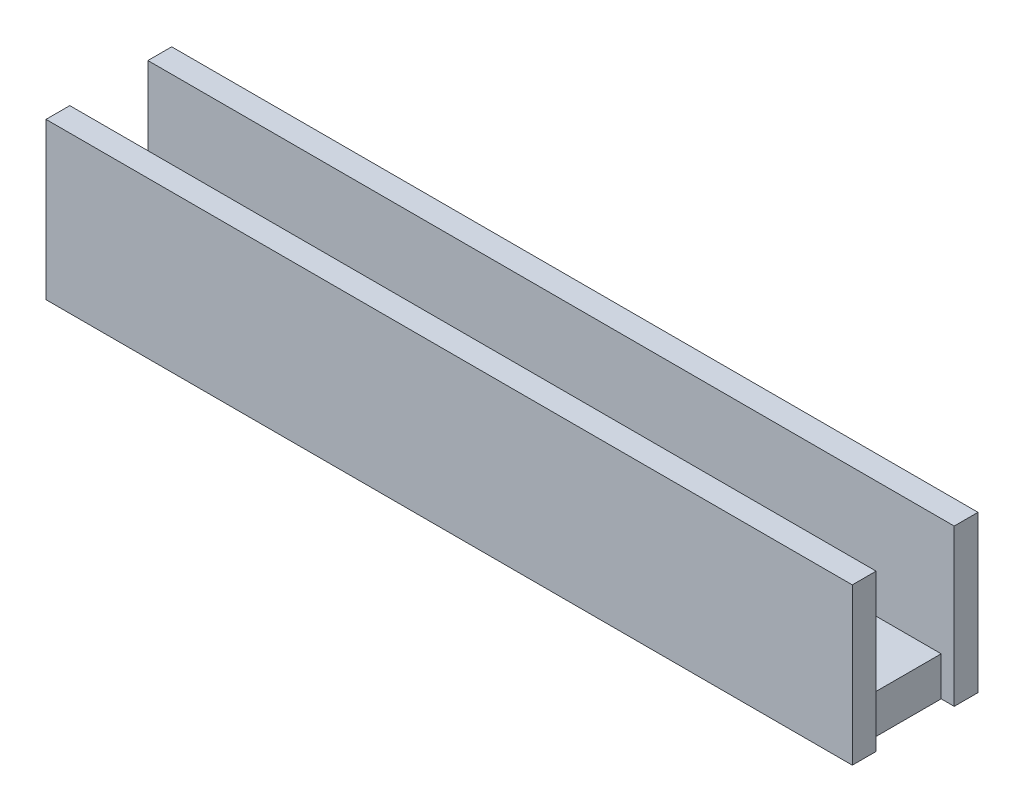
ISO-10303-21;
HEADER;
FILE_DESCRIPTION(('STEP AP214'),'2;1');
FILE_NAME('part.step','',(''),(''),'','','');
FILE_SCHEMA(('AUTOMOTIVE_DESIGN { 1 0 10303 214 1 1 1 1 }'));
ENDSEC;
DATA;
#1=APPLICATION_CONTEXT('core data for automotive mechanical design processes');
#2=APPLICATION_PROTOCOL_DEFINITION('international standard','automotive_design',2000,#1);
#3=PRODUCT_CONTEXT('',#1,'mechanical');
#4=PRODUCT('Part','Part','',(#3));
#5=PRODUCT_RELATED_PRODUCT_CATEGORY('part','',(#4));
#6=PRODUCT_DEFINITION_FORMATION('','',#4);
#7=PRODUCT_DEFINITION_CONTEXT('part definition',#1,'design');
#8=PRODUCT_DEFINITION('design','',#6,#7);
#9=PRODUCT_DEFINITION_SHAPE('','',#8);
#10=(LENGTH_UNIT() NAMED_UNIT(*) SI_UNIT(.MILLI.,.METRE.));
#11=(NAMED_UNIT(*) PLANE_ANGLE_UNIT() SI_UNIT($,.RADIAN.));
#12=(NAMED_UNIT(*) SI_UNIT($,.STERADIAN.) SOLID_ANGLE_UNIT());
#13=UNCERTAINTY_MEASURE_WITH_UNIT(LENGTH_MEASURE(1.E-05),#10,'distance_accuracy_value','');
#14=(GEOMETRIC_REPRESENTATION_CONTEXT(3) GLOBAL_UNCERTAINTY_ASSIGNED_CONTEXT((#13)) GLOBAL_UNIT_ASSIGNED_CONTEXT((#10,
#11,#12)) REPRESENTATION_CONTEXT('',''));
#15=CARTESIAN_POINT('',(0.,0.,0.));
#16=DIRECTION('',(0.,0.,1.));
#17=DIRECTION('',(1.,0.,0.));
#18=AXIS2_PLACEMENT_3D('',#15,#16,#17);
#19=CARTESIAN_POINT('',(50.83283900378,10.,4.999999906));
#20=DIRECTION('',(1.,0.,0.));
#21=DIRECTION('',(0.,0.,-1.));
#22=AXIS2_PLACEMENT_3D('',#19,#20,#21);
#23=PLANE('',#22);
#24=DIRECTION('',(0.,0.,1.));
#25=VECTOR('',#24,1.);
#26=CARTESIAN_POINT('',(50.83283900378,0.,4.999999906));
#27=LINE('',#26,#25);
#28=CARTESIAN_POINT('',(50.83283900378,0.,4.999999906));
#29=VERTEX_POINT('',#28);
#30=CARTESIAN_POINT('',(50.83283900378,0.,6.52399990599999));
#31=VERTEX_POINT('',#30);
#32=EDGE_CURVE('E12',#29,#31,#27,.T.);
#33=ORIENTED_EDGE('',*,*,#32,.F.);
#34=DIRECTION('',(0.,-1.,0.));
#35=VECTOR('',#34,1.);
#36=CARTESIAN_POINT('',(50.83283900378,10.,4.999999906));
#37=LINE('',#36,#35);
#38=CARTESIAN_POINT('',(50.83283900378,10.,4.999999906));
#39=VERTEX_POINT('',#38);
#40=EDGE_CURVE('E105',#39,#29,#37,.T.);
#41=ORIENTED_EDGE('',*,*,#40,.F.);
#42=DIRECTION('',(0.,0.,1.));
#43=VECTOR('',#42,1.);
#44=CARTESIAN_POINT('',(50.83283900378,10.,4.999999906));
#45=LINE('',#44,#43);
#46=CARTESIAN_POINT('',(50.83283900378,10.,6.52399990599999));
#47=VERTEX_POINT('',#46);
#48=EDGE_CURVE('E62',#39,#47,#45,.T.);
#49=ORIENTED_EDGE('',*,*,#48,.T.);
#50=DIRECTION('',(0.,-1.,0.));
#51=VECTOR('',#50,1.);
#52=CARTESIAN_POINT('',(50.83283900378,10.,6.52399990599999));
#53=LINE('',#52,#51);
#54=EDGE_CURVE('E77',#47,#31,#53,.T.);
#55=ORIENTED_EDGE('',*,*,#54,.T.);
#56=EDGE_LOOP('',(#33,#41,#49,#55));
#57=FACE_BOUND('',#56,.T.);
#58=ADVANCED_FACE('F58',(#57),#23,.T.);
#59=CARTESIAN_POINT('',(-0.792660996219982,10.,4.999999906));
#60=DIRECTION('',(0.,0.,-1.));
#61=DIRECTION('',(-1.,0.,0.));
#62=AXIS2_PLACEMENT_3D('',#59,#60,#61);
#63=PLANE('',#62);
#64=DIRECTION('',(1.,0.,0.));
#65=VECTOR('',#64,1.);
#66=CARTESIAN_POINT('',(-0.792660996219982,0.,4.999999906));
#67=LINE('',#66,#65);
#68=CARTESIAN_POINT('',(-0.792660996219982,0.,4.999999906));
#69=VERTEX_POINT('',#68);
#70=EDGE_CURVE('E118',#69,#29,#67,.T.);
#71=ORIENTED_EDGE('',*,*,#70,.F.);
#72=DIRECTION('',(0.,-1.,0.));
#73=VECTOR('',#72,1.);
#74=CARTESIAN_POINT('',(-0.792660996219982,10.,4.999999906));
#75=LINE('',#74,#73);
#76=CARTESIAN_POINT('',(-0.792660996219982,10.,4.999999906));
#77=VERTEX_POINT('',#76);
#78=EDGE_CURVE('E107',#77,#69,#75,.T.);
#79=ORIENTED_EDGE('',*,*,#78,.F.);
#80=DIRECTION('',(1.,0.,0.));
#81=VECTOR('',#80,1.);
#82=CARTESIAN_POINT('',(-0.792660996219982,10.,4.999999906));
#83=LINE('',#82,#81);
#84=EDGE_CURVE('E126',#77,#39,#83,.T.);
#85=ORIENTED_EDGE('',*,*,#84,.T.);
#86=ORIENTED_EDGE('',*,*,#40,.T.);
#87=EDGE_LOOP('',(#71,#79,#85,#86));
#88=FACE_BOUND('',#87,.T.);
#89=ADVANCED_FACE('F120',(#88),#63,.T.);
#90=CARTESIAN_POINT('',(-0.792660996219982,10.,6.523999906));
#91=DIRECTION('',(-1.,0.,0.));
#92=DIRECTION('',(0.,0.,1.));
#93=AXIS2_PLACEMENT_3D('',#90,#91,#92);
#94=PLANE('',#93);
#95=DIRECTION('',(0.,0.,-1.));
#96=VECTOR('',#95,1.);
#97=CARTESIAN_POINT('',(-0.792660996219982,0.,6.523999906));
#98=LINE('',#97,#96);
#99=CARTESIAN_POINT('',(-0.792660996219982,0.,6.523999906));
#100=VERTEX_POINT('',#99);
#101=EDGE_CURVE('E110',#100,#69,#98,.T.);
#102=ORIENTED_EDGE('',*,*,#101,.F.);
#103=DIRECTION('',(0.,-1.,0.));
#104=VECTOR('',#103,1.);
#105=CARTESIAN_POINT('',(-0.792660996219982,10.,6.523999906));
#106=LINE('',#105,#104);
#107=CARTESIAN_POINT('',(-0.792660996219982,10.,6.523999906));
#108=VERTEX_POINT('',#107);
#109=EDGE_CURVE('E94',#108,#100,#106,.T.);
#110=ORIENTED_EDGE('',*,*,#109,.F.);
#111=DIRECTION('',(0.,0.,-1.));
#112=VECTOR('',#111,1.);
#113=CARTESIAN_POINT('',(-0.792660996219982,10.,6.523999906));
#114=LINE('',#113,#112);
#115=EDGE_CURVE('E112',#108,#77,#114,.T.);
#116=ORIENTED_EDGE('',*,*,#115,.T.);
#117=ORIENTED_EDGE('',*,*,#78,.T.);
#118=EDGE_LOOP('',(#102,#110,#116,#117));
#119=FACE_BOUND('',#118,.T.);
#120=ADVANCED_FACE('F109',(#119),#94,.T.);
#121=CARTESIAN_POINT('',(50.83283900378,10.,6.52399990599999));
#122=DIRECTION('',(0.,0.,1.));
#123=DIRECTION('',(1.,0.,0.));
#124=AXIS2_PLACEMENT_3D('',#121,#122,#123);
#125=PLANE('',#124);
#126=DIRECTION('',(-1.,0.,0.));
#127=VECTOR('',#126,1.);
#128=CARTESIAN_POINT('',(50.83283900378,0.,6.52399990599999));
#129=LINE('',#128,#127);
#130=EDGE_CURVE('E68',#31,#100,#129,.T.);
#131=ORIENTED_EDGE('',*,*,#130,.F.);
#132=ORIENTED_EDGE('',*,*,#54,.F.);
#133=DIRECTION('',(-1.,0.,0.));
#134=VECTOR('',#133,1.);
#135=CARTESIAN_POINT('',(50.83283900378,10.,6.52399990599999));
#136=LINE('',#135,#134);
#137=EDGE_CURVE('E122',#47,#108,#136,.T.);
#138=ORIENTED_EDGE('',*,*,#137,.T.);
#139=ORIENTED_EDGE('',*,*,#109,.T.);
#140=EDGE_LOOP('',(#131,#132,#138,#139));
#141=FACE_BOUND('',#140,.T.);
#142=ADVANCED_FACE('F128',(#141),#125,.T.);
#143=CARTESIAN_POINT('',(0.,10.,0.));
#144=DIRECTION('',(0.,-1.,0.));
#145=DIRECTION('',(0.,0.,-1.));
#146=AXIS2_PLACEMENT_3D('',#143,#144,#145);
#147=PLANE('',#146);
#148=ORIENTED_EDGE('',*,*,#48,.F.);
#149=ORIENTED_EDGE('',*,*,#84,.F.);
#150=ORIENTED_EDGE('',*,*,#115,.F.);
#151=ORIENTED_EDGE('',*,*,#137,.F.);
#152=EDGE_LOOP('',(#148,#149,#150,#151));
#153=FACE_BOUND('',#152,.T.);
#154=ADVANCED_FACE('F60',(#153),#147,.F.);
#155=CARTESIAN_POINT('',(0.,0.,0.));
#156=DIRECTION('',(0.,-1.,0.));
#157=DIRECTION('',(0.,0.,-1.));
#158=AXIS2_PLACEMENT_3D('',#155,#156,#157);
#159=PLANE('',#158);
#160=ORIENTED_EDGE('',*,*,#32,.T.);
#161=ORIENTED_EDGE('',*,*,#130,.T.);
#162=ORIENTED_EDGE('',*,*,#101,.T.);
#163=ORIENTED_EDGE('',*,*,#70,.T.);
#164=EDGE_LOOP('',(#160,#161,#162,#163));
#165=FACE_BOUND('',#164,.T.);
#166=ADVANCED_FACE('F117',(#165),#159,.T.);
#167=CLOSED_SHELL('',(#58,#89,#120,#142,#154,#166));
#168=MANIFOLD_SOLID_BREP('B2',#167);
#169=CARTESIAN_POINT('',(50.83283900378,10.,0.));
#170=DIRECTION('',(1.,0.,0.));
#171=DIRECTION('',(0.,0.,-1.));
#172=AXIS2_PLACEMENT_3D('',#169,#170,#171);
#173=PLANE('',#172);
#174=DIRECTION('',(0.,0.,1.));
#175=VECTOR('',#174,1.);
#176=CARTESIAN_POINT('',(50.83283900378,0.,0.));
#177=LINE('',#176,#175);
#178=CARTESIAN_POINT('',(50.83283900378,0.,-1.524));
#179=VERTEX_POINT('',#178);
#180=CARTESIAN_POINT('',(50.83283900378,0.,0.));
#181=VERTEX_POINT('',#180);
#182=EDGE_CURVE('E272',#179,#181,#177,.T.);
#183=ORIENTED_EDGE('',*,*,#182,.F.);
#184=DIRECTION('',(0.,-1.,0.));
#185=VECTOR('',#184,1.);
#186=CARTESIAN_POINT('',(50.83283900378,10.,-1.524));
#187=LINE('',#186,#185);
#188=CARTESIAN_POINT('',(50.83283900378,10.,-1.524));
#189=VERTEX_POINT('',#188);
#190=EDGE_CURVE('E56',#189,#179,#187,.T.);
#191=ORIENTED_EDGE('',*,*,#190,.F.);
#192=DIRECTION('',(0.,0.,1.));
#193=VECTOR('',#192,1.);
#194=CARTESIAN_POINT('',(50.83283900378,10.,0.));
#195=LINE('',#194,#193);
#196=CARTESIAN_POINT('',(50.83283900378,10.,0.));
#197=VERTEX_POINT('',#196);
#198=EDGE_CURVE('E263',#189,#197,#195,.T.);
#199=ORIENTED_EDGE('',*,*,#198,.T.);
#200=DIRECTION('',(0.,-1.,0.));
#201=VECTOR('',#200,1.);
#202=CARTESIAN_POINT('',(50.83283900378,10.,0.));
#203=LINE('',#202,#201);
#204=EDGE_CURVE('E242',#197,#181,#203,.T.);
#205=ORIENTED_EDGE('',*,*,#204,.T.);
#206=EDGE_LOOP('',(#183,#191,#199,#205));
#207=FACE_BOUND('',#206,.T.);
#208=ADVANCED_FACE('F203',(#207),#173,.T.);
#209=CARTESIAN_POINT('',(0.,10.,-1.524));
#210=DIRECTION('',(0.,0.,-1.));
#211=DIRECTION('',(-1.,0.,0.));
#212=AXIS2_PLACEMENT_3D('',#209,#210,#211);
#213=PLANE('',#212);
#214=DIRECTION('',(1.,0.,0.));
#215=VECTOR('',#214,1.);
#216=CARTESIAN_POINT('',(0.,0.,-1.524));
#217=LINE('',#216,#215);
#218=CARTESIAN_POINT('',(-0.792660996219982,0.,-1.524));
#219=VERTEX_POINT('',#218);
#220=EDGE_CURVE('E255',#219,#179,#217,.T.);
#221=ORIENTED_EDGE('',*,*,#220,.F.);
#222=DIRECTION('',(0.,-1.,0.));
#223=VECTOR('',#222,1.);
#224=CARTESIAN_POINT('',(-0.792660996219982,10.,-1.524));
#225=LINE('',#224,#223);
#226=CARTESIAN_POINT('',(-0.792660996219982,10.,-1.524));
#227=VERTEX_POINT('',#226);
#228=EDGE_CURVE('E212',#227,#219,#225,.T.);
#229=ORIENTED_EDGE('',*,*,#228,.F.);
#230=DIRECTION('',(1.,0.,0.));
#231=VECTOR('',#230,1.);
#232=CARTESIAN_POINT('',(0.,10.,-1.524));
#233=LINE('',#232,#231);
#234=EDGE_CURVE('E253',#227,#189,#233,.T.);
#235=ORIENTED_EDGE('',*,*,#234,.T.);
#236=ORIENTED_EDGE('',*,*,#190,.T.);
#237=EDGE_LOOP('',(#221,#229,#235,#236));
#238=FACE_BOUND('',#237,.T.);
#239=ADVANCED_FACE('F251',(#238),#213,.T.);
#240=CARTESIAN_POINT('',(-0.792660996219982,10.,0.));
#241=DIRECTION('',(1.,0.,0.));
#242=DIRECTION('',(0.,0.,-1.));
#243=AXIS2_PLACEMENT_3D('',#240,#241,#242);
#244=PLANE('',#243);
#245=DIRECTION('',(0.,0.,1.));
#246=VECTOR('',#245,1.);
#247=CARTESIAN_POINT('',(-0.792660996219982,0.,0.));
#248=LINE('',#247,#246);
#249=CARTESIAN_POINT('',(-0.792660996219982,0.,0.));
#250=VERTEX_POINT('',#249);
#251=EDGE_CURVE('E235',#219,#250,#248,.T.);
#252=ORIENTED_EDGE('',*,*,#251,.T.);
#253=DIRECTION('',(0.,-1.,0.));
#254=VECTOR('',#253,1.);
#255=CARTESIAN_POINT('',(-0.792660996219982,10.,0.));
#256=LINE('',#255,#254);
#257=CARTESIAN_POINT('',(-0.792660996219982,10.,0.));
#258=VERTEX_POINT('',#257);
#259=EDGE_CURVE('E257',#258,#250,#256,.T.);
#260=ORIENTED_EDGE('',*,*,#259,.F.);
#261=DIRECTION('',(0.,0.,1.));
#262=VECTOR('',#261,1.);
#263=CARTESIAN_POINT('',(-0.792660996219982,10.,0.));
#264=LINE('',#263,#262);
#265=EDGE_CURVE('E258',#227,#258,#264,.T.);
#266=ORIENTED_EDGE('',*,*,#265,.F.);
#267=ORIENTED_EDGE('',*,*,#228,.T.);
#268=EDGE_LOOP('',(#252,#260,#266,#267));
#269=FACE_BOUND('',#268,.T.);
#270=ADVANCED_FACE('F259',(#269),#244,.F.);
#271=CARTESIAN_POINT('',(0.,10.,0.));
#272=DIRECTION('',(0.,0.,-1.));
#273=DIRECTION('',(-1.,0.,0.));
#274=AXIS2_PLACEMENT_3D('',#271,#272,#273);
#275=PLANE('',#274);
#276=DIRECTION('',(1.,0.,0.));
#277=VECTOR('',#276,1.);
#278=CARTESIAN_POINT('',(0.,0.,0.));
#279=LINE('',#278,#277);
#280=EDGE_CURVE('E267',#250,#181,#279,.T.);
#281=ORIENTED_EDGE('',*,*,#280,.T.);
#282=ORIENTED_EDGE('',*,*,#204,.F.);
#283=DIRECTION('',(1.,0.,0.));
#284=VECTOR('',#283,1.);
#285=CARTESIAN_POINT('',(0.,10.,0.));
#286=LINE('',#285,#284);
#287=EDGE_CURVE('E220',#258,#197,#286,.T.);
#288=ORIENTED_EDGE('',*,*,#287,.F.);
#289=ORIENTED_EDGE('',*,*,#259,.T.);
#290=EDGE_LOOP('',(#281,#282,#288,#289));
#291=FACE_BOUND('',#290,.T.);
#292=ADVANCED_FACE('F287',(#291),#275,.F.);
#293=CARTESIAN_POINT('',(0.,10.,0.));
#294=DIRECTION('',(0.,1.,0.));
#295=DIRECTION('',(0.,0.,1.));
#296=AXIS2_PLACEMENT_3D('',#293,#294,#295);
#297=PLANE('',#296);
#298=ORIENTED_EDGE('',*,*,#198,.F.);
#299=ORIENTED_EDGE('',*,*,#234,.F.);
#300=ORIENTED_EDGE('',*,*,#265,.T.);
#301=ORIENTED_EDGE('',*,*,#287,.T.);
#302=EDGE_LOOP('',(#298,#299,#300,#301));
#303=FACE_BOUND('',#302,.T.);
#304=ADVANCED_FACE('F262',(#303),#297,.T.);
#305=CARTESIAN_POINT('',(0.,0.,0.));
#306=DIRECTION('',(0.,1.,0.));
#307=DIRECTION('',(0.,0.,1.));
#308=AXIS2_PLACEMENT_3D('',#305,#306,#307);
#309=PLANE('',#308);
#310=ORIENTED_EDGE('',*,*,#182,.T.);
#311=ORIENTED_EDGE('',*,*,#280,.F.);
#312=ORIENTED_EDGE('',*,*,#251,.F.);
#313=ORIENTED_EDGE('',*,*,#220,.T.);
#314=EDGE_LOOP('',(#310,#311,#312,#313));
#315=FACE_BOUND('',#314,.T.);
#316=ADVANCED_FACE('F289',(#315),#309,.F.);
#317=CLOSED_SHELL('',(#208,#239,#270,#292,#304,#316));
#318=MANIFOLD_SOLID_BREP('B6',#317);
#319=CARTESIAN_POINT('',(50.,2.5,0.));
#320=DIRECTION('',(1.,0.,0.));
#321=DIRECTION('',(0.,0.,-1.));
#322=AXIS2_PLACEMENT_3D('',#319,#320,#321);
#323=PLANE('',#322);
#324=DIRECTION('',(0.,0.,1.));
#325=VECTOR('',#324,1.);
#326=CARTESIAN_POINT('',(50.,0.,0.));
#327=LINE('',#326,#325);
#328=CARTESIAN_POINT('',(50.,0.,0.));
#329=VERTEX_POINT('',#328);
#330=CARTESIAN_POINT('',(50.,0.,4.999999906));
#331=VERTEX_POINT('',#330);
#332=EDGE_CURVE('E417',#329,#331,#327,.T.);
#333=ORIENTED_EDGE('',*,*,#332,.F.);
#334=DIRECTION('',(0.,-1.,0.));
#335=VECTOR('',#334,1.);
#336=CARTESIAN_POINT('',(50.,2.5,0.));
#337=LINE('',#336,#335);
#338=CARTESIAN_POINT('',(50.,2.5,0.));
#339=VERTEX_POINT('',#338);
#340=EDGE_CURVE('E201',#339,#329,#337,.T.);
#341=ORIENTED_EDGE('',*,*,#340,.F.);
#342=DIRECTION('',(0.,0.,1.));
#343=VECTOR('',#342,1.);
#344=CARTESIAN_POINT('',(50.,2.5,0.));
#345=LINE('',#344,#343);
#346=CARTESIAN_POINT('',(50.,2.5,4.999999906));
#347=VERTEX_POINT('',#346);
#348=EDGE_CURVE('E411',#339,#347,#345,.T.);
#349=ORIENTED_EDGE('',*,*,#348,.T.);
#350=DIRECTION('',(0.,-1.,0.));
#351=VECTOR('',#350,1.);
#352=CARTESIAN_POINT('',(50.,2.5,4.999999906));
#353=LINE('',#352,#351);
#354=EDGE_CURVE('E392',#347,#331,#353,.T.);
#355=ORIENTED_EDGE('',*,*,#354,.T.);
#356=EDGE_LOOP('',(#333,#341,#349,#355));
#357=FACE_BOUND('',#356,.T.);
#358=ADVANCED_FACE('F354',(#357),#323,.T.);
#359=CARTESIAN_POINT('',(0.,2.5,0.));
#360=DIRECTION('',(0.,0.,-1.));
#361=DIRECTION('',(-1.,0.,0.));
#362=AXIS2_PLACEMENT_3D('',#359,#360,#361);
#363=PLANE('',#362);
#364=DIRECTION('',(1.,0.,0.));
#365=VECTOR('',#364,1.);
#366=CARTESIAN_POINT('',(0.,0.,0.));
#367=LINE('',#366,#365);
#368=CARTESIAN_POINT('',(0.,0.,0.));
#369=VERTEX_POINT('',#368);
#370=EDGE_CURVE('E405',#369,#329,#367,.T.);
#371=ORIENTED_EDGE('',*,*,#370,.F.);
#372=DIRECTION('',(0.,-1.,0.));
#373=VECTOR('',#372,1.);
#374=CARTESIAN_POINT('',(0.,2.5,0.));
#375=LINE('',#374,#373);
#376=CARTESIAN_POINT('',(0.,2.5,0.));
#377=VERTEX_POINT('',#376);
#378=EDGE_CURVE('E362',#377,#369,#375,.T.);
#379=ORIENTED_EDGE('',*,*,#378,.F.);
#380=DIRECTION('',(1.,0.,0.));
#381=VECTOR('',#380,1.);
#382=CARTESIAN_POINT('',(0.,2.5,0.));
#383=LINE('',#382,#381);
#384=EDGE_CURVE('E403',#377,#339,#383,.T.);
#385=ORIENTED_EDGE('',*,*,#384,.T.);
#386=ORIENTED_EDGE('',*,*,#340,.T.);
#387=EDGE_LOOP('',(#371,#379,#385,#386));
#388=FACE_BOUND('',#387,.T.);
#389=ADVANCED_FACE('F401',(#388),#363,.T.);
#390=CARTESIAN_POINT('',(0.,2.5,0.));
#391=DIRECTION('',(1.,0.,0.));
#392=DIRECTION('',(0.,0.,-1.));
#393=AXIS2_PLACEMENT_3D('',#390,#391,#392);
#394=PLANE('',#393);
#395=DIRECTION('',(0.,0.,1.));
#396=VECTOR('',#395,1.);
#397=CARTESIAN_POINT('',(0.,0.,0.));
#398=LINE('',#397,#396);
#399=CARTESIAN_POINT('',(0.,0.,4.999999906));
#400=VERTEX_POINT('',#399);
#401=EDGE_CURVE('E385',#369,#400,#398,.T.);
#402=ORIENTED_EDGE('',*,*,#401,.T.);
#403=DIRECTION('',(0.,-1.,0.));
#404=VECTOR('',#403,1.);
#405=CARTESIAN_POINT('',(0.,2.5,4.999999906));
#406=LINE('',#405,#404);
#407=CARTESIAN_POINT('',(0.,2.5,4.999999906));
#408=VERTEX_POINT('',#407);
#409=EDGE_CURVE('E406',#408,#400,#406,.T.);
#410=ORIENTED_EDGE('',*,*,#409,.F.);
#411=DIRECTION('',(0.,0.,1.));
#412=VECTOR('',#411,1.);
#413=CARTESIAN_POINT('',(0.,2.5,0.));
#414=LINE('',#413,#412);
#415=EDGE_CURVE('E407',#377,#408,#414,.T.);
#416=ORIENTED_EDGE('',*,*,#415,.F.);
#417=ORIENTED_EDGE('',*,*,#378,.T.);
#418=EDGE_LOOP('',(#402,#410,#416,#417));
#419=FACE_BOUND('',#418,.T.);
#420=ADVANCED_FACE('F408',(#419),#394,.F.);
#421=CARTESIAN_POINT('',(0.,2.5,4.999999906));
#422=DIRECTION('',(0.,0.,-1.));
#423=DIRECTION('',(-1.,0.,0.));
#424=AXIS2_PLACEMENT_3D('',#421,#422,#423);
#425=PLANE('',#424);
#426=DIRECTION('',(1.,0.,0.));
#427=VECTOR('',#426,1.);
#428=CARTESIAN_POINT('',(0.,0.,4.999999906));
#429=LINE('',#428,#427);
#430=EDGE_CURVE('E413',#400,#331,#429,.T.);
#431=ORIENTED_EDGE('',*,*,#430,.T.);
#432=ORIENTED_EDGE('',*,*,#354,.F.);
#433=DIRECTION('',(1.,0.,0.));
#434=VECTOR('',#433,1.);
#435=CARTESIAN_POINT('',(0.,2.5,4.999999906));
#436=LINE('',#435,#434);
#437=EDGE_CURVE('E370',#408,#347,#436,.T.);
#438=ORIENTED_EDGE('',*,*,#437,.F.);
#439=ORIENTED_EDGE('',*,*,#409,.T.);
#440=EDGE_LOOP('',(#431,#432,#438,#439));
#441=FACE_BOUND('',#440,.T.);
#442=ADVANCED_FACE('F426',(#441),#425,.F.);
#443=CARTESIAN_POINT('',(0.,2.5,0.));
#444=DIRECTION('',(0.,1.,0.));
#445=DIRECTION('',(0.,0.,1.));
#446=AXIS2_PLACEMENT_3D('',#443,#444,#445);
#447=PLANE('',#446);
#448=ORIENTED_EDGE('',*,*,#348,.F.);
#449=ORIENTED_EDGE('',*,*,#384,.F.);
#450=ORIENTED_EDGE('',*,*,#415,.T.);
#451=ORIENTED_EDGE('',*,*,#437,.T.);
#452=EDGE_LOOP('',(#448,#449,#450,#451));
#453=FACE_BOUND('',#452,.T.);
#454=ADVANCED_FACE('F410',(#453),#447,.T.);
#455=CARTESIAN_POINT('',(0.,0.,0.));
#456=DIRECTION('',(0.,1.,0.));
#457=DIRECTION('',(0.,0.,1.));
#458=AXIS2_PLACEMENT_3D('',#455,#456,#457);
#459=PLANE('',#458);
#460=ORIENTED_EDGE('',*,*,#332,.T.);
#461=ORIENTED_EDGE('',*,*,#430,.F.);
#462=ORIENTED_EDGE('',*,*,#401,.F.);
#463=ORIENTED_EDGE('',*,*,#370,.T.);
#464=EDGE_LOOP('',(#460,#461,#462,#463));
#465=FACE_BOUND('',#464,.T.);
#466=ADVANCED_FACE('F428',(#465),#459,.F.);
#467=CLOSED_SHELL('',(#358,#389,#420,#442,#454,#466));
#468=MANIFOLD_SOLID_BREP('B50',#467);
#469=ADVANCED_BREP_SHAPE_REPRESENTATION('',(#18,#168,#318,#468),#14);
#470=SHAPE_DEFINITION_REPRESENTATION(#9,#469);
ENDSEC;
END-ISO-10303-21;
